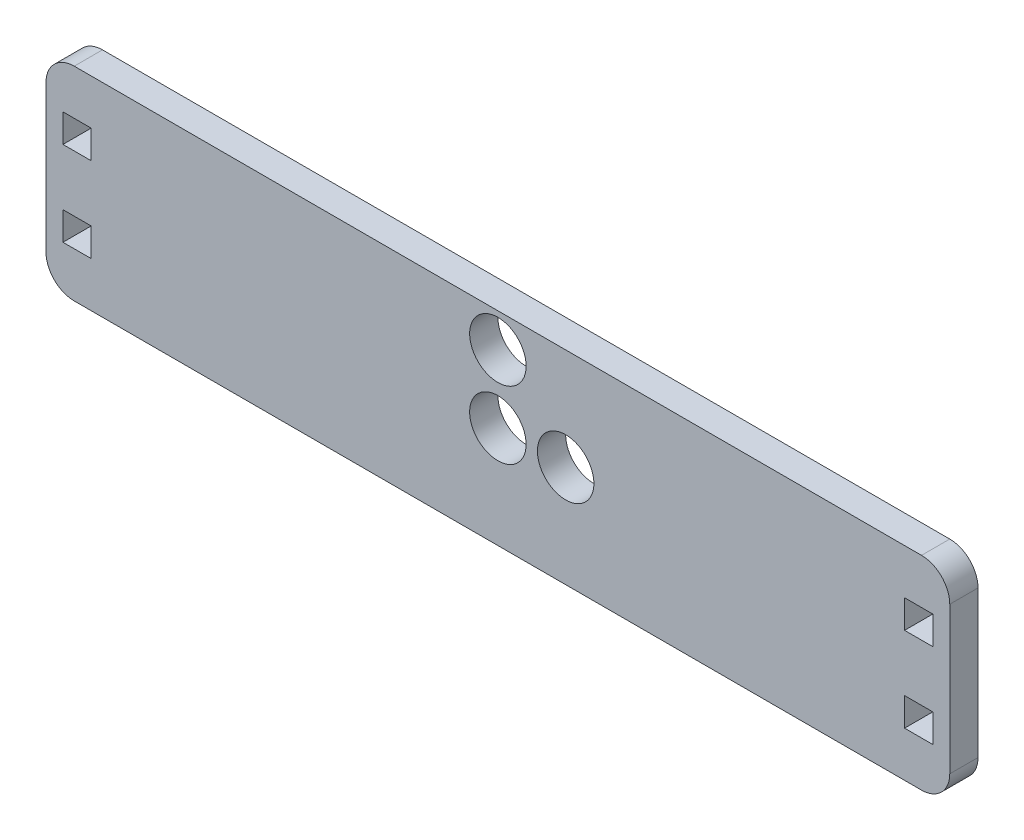
ISO-10303-21;
HEADER;
FILE_DESCRIPTION(('STEP AP214'),'2;1');
FILE_NAME('part.step','',(''),(''),'','','');
FILE_SCHEMA(('AUTOMOTIVE_DESIGN { 1 0 10303 214 1 1 1 1 }'));
ENDSEC;
DATA;
#1=APPLICATION_CONTEXT('core data for automotive mechanical design processes');
#2=APPLICATION_PROTOCOL_DEFINITION('international standard','automotive_design',2000,#1);
#3=PRODUCT_CONTEXT('',#1,'mechanical');
#4=PRODUCT('Part','Part','',(#3));
#5=PRODUCT_RELATED_PRODUCT_CATEGORY('part','',(#4));
#6=PRODUCT_DEFINITION_FORMATION('','',#4);
#7=PRODUCT_DEFINITION_CONTEXT('part definition',#1,'design');
#8=PRODUCT_DEFINITION('design','',#6,#7);
#9=PRODUCT_DEFINITION_SHAPE('','',#8);
#10=(LENGTH_UNIT() NAMED_UNIT(*) SI_UNIT(.MILLI.,.METRE.));
#11=(NAMED_UNIT(*) PLANE_ANGLE_UNIT() SI_UNIT($,.RADIAN.));
#12=(NAMED_UNIT(*) SI_UNIT($,.STERADIAN.) SOLID_ANGLE_UNIT());
#13=UNCERTAINTY_MEASURE_WITH_UNIT(LENGTH_MEASURE(1.E-05),#10,'distance_accuracy_value','');
#14=(GEOMETRIC_REPRESENTATION_CONTEXT(3) GLOBAL_UNCERTAINTY_ASSIGNED_CONTEXT((#13)) GLOBAL_UNIT_ASSIGNED_CONTEXT((#10,
#11,#12)) REPRESENTATION_CONTEXT('',''));
#15=CARTESIAN_POINT('',(0.,0.,0.));
#16=DIRECTION('',(0.,0.,1.));
#17=DIRECTION('',(1.,0.,0.));
#18=AXIS2_PLACEMENT_3D('',#15,#16,#17);
#19=CARTESIAN_POINT('',(0.,0.,5.));
#20=DIRECTION('',(0.,0.,-1.));
#21=DIRECTION('',(-1.,0.,0.));
#22=AXIS2_PLACEMENT_3D('',#19,#20,#21);
#23=PLANE('',#22);
#24=DIRECTION('',(1.,0.,0.));
#25=VECTOR('',#24,1.);
#26=CARTESIAN_POINT('',(-77.,5.,5.00000000000032));
#27=LINE('',#26,#25);
#28=CARTESIAN_POINT('',(-77.,5.,5.00000000000032));
#29=VERTEX_POINT('',#28);
#30=CARTESIAN_POINT('',(-72.,5.,5.00000000000029));
#31=VERTEX_POINT('',#30);
#32=EDGE_CURVE('E241',#29,#31,#27,.T.);
#33=ORIENTED_EDGE('',*,*,#32,.F.);
#34=DIRECTION('',(0.,-1.,0.));
#35=VECTOR('',#34,1.);
#36=CARTESIAN_POINT('',(-77.,5.,5.00000000000032));
#37=LINE('',#36,#35);
#38=CARTESIAN_POINT('',(-77.,10.,5.));
#39=VERTEX_POINT('',#38);
#40=EDGE_CURVE('E249',#39,#29,#37,.T.);
#41=ORIENTED_EDGE('',*,*,#40,.F.);
#42=DIRECTION('',(-1.,0.,0.));
#43=VECTOR('',#42,1.);
#44=CARTESIAN_POINT('',(-77.,10.,5.00000000000032));
#45=LINE('',#44,#43);
#46=CARTESIAN_POINT('',(-72.,10.,5.00000000000029));
#47=VERTEX_POINT('',#46);
#48=EDGE_CURVE('E246',#47,#39,#45,.T.);
#49=ORIENTED_EDGE('',*,*,#48,.F.);
#50=DIRECTION('',(0.,1.,0.));
#51=VECTOR('',#50,1.);
#52=CARTESIAN_POINT('',(-72.,5.,5.00000000000029));
#53=LINE('',#52,#51);
#54=EDGE_CURVE('E243',#31,#47,#53,.T.);
#55=ORIENTED_EDGE('',*,*,#54,.F.);
#56=EDGE_LOOP('',(#33,#41,#49,#55));
#57=FACE_BOUND('',#56,.T.);
#58=DIRECTION('',(1.,0.,0.));
#59=VECTOR('',#58,1.);
#60=CARTESIAN_POINT('',(77.,5.,5.));
#61=LINE('',#60,#59);
#62=CARTESIAN_POINT('',(72.,5.,5.));
#63=VERTEX_POINT('',#62);
#64=CARTESIAN_POINT('',(77.,5.,5.));
#65=VERTEX_POINT('',#64);
#66=EDGE_CURVE('E303',#63,#65,#61,.T.);
#67=ORIENTED_EDGE('',*,*,#66,.F.);
#68=DIRECTION('',(0.,-1.,0.));
#69=VECTOR('',#68,1.);
#70=CARTESIAN_POINT('',(72.,5.,5.));
#71=LINE('',#70,#69);
#72=CARTESIAN_POINT('',(72.,10.,5.));
#73=VERTEX_POINT('',#72);
#74=EDGE_CURVE('E311',#73,#63,#71,.T.);
#75=ORIENTED_EDGE('',*,*,#74,.F.);
#76=DIRECTION('',(-1.,0.,0.));
#77=VECTOR('',#76,1.);
#78=CARTESIAN_POINT('',(77.,10.,5.));
#79=LINE('',#78,#77);
#80=CARTESIAN_POINT('',(77.,10.,5.));
#81=VERTEX_POINT('',#80);
#82=EDGE_CURVE('E308',#81,#73,#79,.T.);
#83=ORIENTED_EDGE('',*,*,#82,.F.);
#84=DIRECTION('',(0.,1.,0.));
#85=VECTOR('',#84,1.);
#86=CARTESIAN_POINT('',(77.,5.,5.));
#87=LINE('',#86,#85);
#88=EDGE_CURVE('E305',#65,#81,#87,.T.);
#89=ORIENTED_EDGE('',*,*,#88,.F.);
#90=EDGE_LOOP('',(#67,#75,#83,#89));
#91=FACE_BOUND('',#90,.T.);
#92=DIRECTION('',(1.,0.,0.));
#93=VECTOR('',#92,1.);
#94=CARTESIAN_POINT('',(80.,-18.,5.));
#95=LINE('',#94,#93);
#96=CARTESIAN_POINT('',(-75.,-18.,5.));
#97=VERTEX_POINT('',#96);
#98=CARTESIAN_POINT('',(75.,-18.,5.));
#99=VERTEX_POINT('',#98);
#100=EDGE_CURVE('E355',#97,#99,#95,.T.);
#101=ORIENTED_EDGE('',*,*,#100,.T.);
#102=CARTESIAN_POINT('',(75.,-13.,5.));
#103=DIRECTION('',(0.,0.,-1.));
#104=DIRECTION('',(-1.,0.,0.));
#105=AXIS2_PLACEMENT_3D('',#102,#103,#104);
#106=CIRCLE('',#105,5.);
#107=CARTESIAN_POINT('',(80.,-13.,5.));
#108=VERTEX_POINT('',#107);
#109=EDGE_CURVE('E395',#99,#108,#106,.F.);
#110=ORIENTED_EDGE('',*,*,#109,.T.);
#111=DIRECTION('',(0.,1.,0.));
#112=VECTOR('',#111,1.);
#113=CARTESIAN_POINT('',(80.,18.,5.));
#114=LINE('',#113,#112);
#115=CARTESIAN_POINT('',(80.,13.,5.));
#116=VERTEX_POINT('',#115);
#117=EDGE_CURVE('E359',#108,#116,#114,.T.);
#118=ORIENTED_EDGE('',*,*,#117,.T.);
#119=CARTESIAN_POINT('',(75.,13.,5.));
#120=DIRECTION('',(0.,0.,-1.));
#121=DIRECTION('',(-1.,0.,0.));
#122=AXIS2_PLACEMENT_3D('',#119,#120,#121);
#123=CIRCLE('',#122,5.);
#124=CARTESIAN_POINT('',(75.,18.,5.));
#125=VERTEX_POINT('',#124);
#126=EDGE_CURVE('E59',#116,#125,#123,.F.);
#127=ORIENTED_EDGE('',*,*,#126,.T.);
#128=DIRECTION('',(-1.,0.,0.));
#129=VECTOR('',#128,1.);
#130=CARTESIAN_POINT('',(-80.,18.,5.));
#131=LINE('',#130,#129);
#132=CARTESIAN_POINT('',(-75.,18.,5.));
#133=VERTEX_POINT('',#132);
#134=EDGE_CURVE('E361',#125,#133,#131,.T.);
#135=ORIENTED_EDGE('',*,*,#134,.T.);
#136=CARTESIAN_POINT('',(-75.,13.,5.));
#137=DIRECTION('',(0.,0.,-1.));
#138=DIRECTION('',(-1.,0.,0.));
#139=AXIS2_PLACEMENT_3D('',#136,#137,#138);
#140=CIRCLE('',#139,5.);
#141=CARTESIAN_POINT('',(-80.,13.,5.));
#142=VERTEX_POINT('',#141);
#143=EDGE_CURVE('E390',#133,#142,#140,.F.);
#144=ORIENTED_EDGE('',*,*,#143,.T.);
#145=DIRECTION('',(0.,-1.,0.));
#146=VECTOR('',#145,1.);
#147=CARTESIAN_POINT('',(-80.,-18.,5.));
#148=LINE('',#147,#146);
#149=CARTESIAN_POINT('',(-80.,-13.,5.));
#150=VERTEX_POINT('',#149);
#151=EDGE_CURVE('E352',#142,#150,#148,.T.);
#152=ORIENTED_EDGE('',*,*,#151,.T.);
#153=CARTESIAN_POINT('',(-75.,-13.,5.));
#154=DIRECTION('',(0.,0.,-1.));
#155=DIRECTION('',(-1.,0.,0.));
#156=AXIS2_PLACEMENT_3D('',#153,#154,#155);
#157=CIRCLE('',#156,5.);
#158=EDGE_CURVE('E392',#150,#97,#157,.F.);
#159=ORIENTED_EDGE('',*,*,#158,.T.);
#160=EDGE_LOOP('',(#101,#110,#118,#127,#135,#144,#152,#159));
#161=FACE_BOUND('',#160,.T.);
#162=CARTESIAN_POINT('',(0.,0.,5.));
#163=DIRECTION('',(0.,0.,1.));
#164=DIRECTION('',(1.,0.,0.));
#165=AXIS2_PLACEMENT_3D('',#162,#163,#164);
#166=CIRCLE('',#165,5.);
#167=CARTESIAN_POINT('',(5.,0.,5.));
#168=VERTEX_POINT('',#167);
#169=EDGE_CURVE('E346',#168,#168,#166,.T.);
#170=ORIENTED_EDGE('',*,*,#169,.F.);
#171=EDGE_LOOP('',(#170));
#172=FACE_BOUND('',#171,.T.);
#173=CARTESIAN_POINT('',(12.,0.,5.));
#174=DIRECTION('',(0.,0.,1.));
#175=DIRECTION('',(1.,0.,0.));
#176=AXIS2_PLACEMENT_3D('',#173,#174,#175);
#177=CIRCLE('',#176,5.);
#178=CARTESIAN_POINT('',(17.,0.,5.));
#179=VERTEX_POINT('',#178);
#180=EDGE_CURVE('E340',#179,#179,#177,.T.);
#181=ORIENTED_EDGE('',*,*,#180,.F.);
#182=EDGE_LOOP('',(#181));
#183=FACE_BOUND('',#182,.T.);
#184=CARTESIAN_POINT('',(0.,12.,5.));
#185=DIRECTION('',(0.,0.,1.));
#186=DIRECTION('',(1.,0.,0.));
#187=AXIS2_PLACEMENT_3D('',#184,#185,#186);
#188=CIRCLE('',#187,5.);
#189=CARTESIAN_POINT('',(5.,12.,5.));
#190=VERTEX_POINT('',#189);
#191=EDGE_CURVE('E334',#190,#190,#188,.T.);
#192=ORIENTED_EDGE('',*,*,#191,.F.);
#193=EDGE_LOOP('',(#192));
#194=FACE_BOUND('',#193,.T.);
#195=DIRECTION('',(-1.,0.,0.));
#196=VECTOR('',#195,1.);
#197=CARTESIAN_POINT('',(77.,-5.,5.));
#198=LINE('',#197,#196);
#199=CARTESIAN_POINT('',(77.,-5.,5.));
#200=VERTEX_POINT('',#199);
#201=CARTESIAN_POINT('',(72.,-5.,5.));
#202=VERTEX_POINT('',#201);
#203=EDGE_CURVE('E272',#200,#202,#198,.T.);
#204=ORIENTED_EDGE('',*,*,#203,.F.);
#205=DIRECTION('',(0.,1.,0.));
#206=VECTOR('',#205,1.);
#207=CARTESIAN_POINT('',(77.,-5.,5.));
#208=LINE('',#207,#206);
#209=CARTESIAN_POINT('',(77.,-10.,5.));
#210=VERTEX_POINT('',#209);
#211=EDGE_CURVE('E280',#210,#200,#208,.T.);
#212=ORIENTED_EDGE('',*,*,#211,.F.);
#213=DIRECTION('',(1.,0.,0.));
#214=VECTOR('',#213,1.);
#215=CARTESIAN_POINT('',(77.,-10.,5.));
#216=LINE('',#215,#214);
#217=CARTESIAN_POINT('',(72.,-10.,5.));
#218=VERTEX_POINT('',#217);
#219=EDGE_CURVE('E277',#218,#210,#216,.T.);
#220=ORIENTED_EDGE('',*,*,#219,.F.);
#221=DIRECTION('',(0.,-1.,0.));
#222=VECTOR('',#221,1.);
#223=CARTESIAN_POINT('',(72.,-5.,5.));
#224=LINE('',#223,#222);
#225=EDGE_CURVE('E274',#202,#218,#224,.T.);
#226=ORIENTED_EDGE('',*,*,#225,.F.);
#227=EDGE_LOOP('',(#204,#212,#220,#226));
#228=FACE_BOUND('',#227,.T.);
#229=DIRECTION('',(-1.,0.,0.));
#230=VECTOR('',#229,1.);
#231=CARTESIAN_POINT('',(-77.,-5.,5.00000000000032));
#232=LINE('',#231,#230);
#233=CARTESIAN_POINT('',(-72.,-5.,5.00000000000029));
#234=VERTEX_POINT('',#233);
#235=CARTESIAN_POINT('',(-77.,-5.,5.00000000000032));
#236=VERTEX_POINT('',#235);
#237=EDGE_CURVE('E200',#234,#236,#232,.T.);
#238=ORIENTED_EDGE('',*,*,#237,.F.);
#239=DIRECTION('',(0.,1.,0.));
#240=VECTOR('',#239,1.);
#241=CARTESIAN_POINT('',(-72.,-5.,5.00000000000029));
#242=LINE('',#241,#240);
#243=CARTESIAN_POINT('',(-72.,-10.,5.));
#244=VERTEX_POINT('',#243);
#245=EDGE_CURVE('E225',#244,#234,#242,.T.);
#246=ORIENTED_EDGE('',*,*,#245,.F.);
#247=DIRECTION('',(1.,0.,0.));
#248=VECTOR('',#247,1.);
#249=CARTESIAN_POINT('',(-77.,-10.,5.00000000000032));
#250=LINE('',#249,#248);
#251=CARTESIAN_POINT('',(-77.,-10.,5.00000000000032));
#252=VERTEX_POINT('',#251);
#253=EDGE_CURVE('E223',#252,#244,#250,.T.);
#254=ORIENTED_EDGE('',*,*,#253,.F.);
#255=DIRECTION('',(0.,-1.,0.));
#256=VECTOR('',#255,1.);
#257=CARTESIAN_POINT('',(-77.,-5.,5.00000000000032));
#258=LINE('',#257,#256);
#259=EDGE_CURVE('E210',#236,#252,#258,.T.);
#260=ORIENTED_EDGE('',*,*,#259,.F.);
#261=EDGE_LOOP('',(#238,#246,#254,#260));
#262=FACE_BOUND('',#261,.T.);
#263=ADVANCED_FACE('F37',(#57,#91,#161,#172,#183,#194,#228,#262),#23,.F.);
#264=CARTESIAN_POINT('',(0.,0.,0.));
#265=DIRECTION('',(0.,0.,-1.));
#266=DIRECTION('',(-1.,0.,0.));
#267=AXIS2_PLACEMENT_3D('',#264,#265,#266);
#268=PLANE('',#267);
#269=CARTESIAN_POINT('',(12.,0.,0.));
#270=DIRECTION('',(0.,0.,1.));
#271=DIRECTION('',(1.,0.,0.));
#272=AXIS2_PLACEMENT_3D('',#269,#270,#271);
#273=CIRCLE('',#272,5.);
#274=CARTESIAN_POINT('',(17.,0.,0.));
#275=VERTEX_POINT('',#274);
#276=EDGE_CURVE('E337',#275,#275,#273,.T.);
#277=ORIENTED_EDGE('',*,*,#276,.T.);
#278=EDGE_LOOP('',(#277));
#279=FACE_BOUND('',#278,.T.);
#280=DIRECTION('',(0.,1.,0.));
#281=VECTOR('',#280,1.);
#282=CARTESIAN_POINT('',(80.,18.,0.));
#283=LINE('',#282,#281);
#284=CARTESIAN_POINT('',(80.,-13.,0.));
#285=VERTEX_POINT('',#284);
#286=CARTESIAN_POINT('',(80.,13.,0.));
#287=VERTEX_POINT('',#286);
#288=EDGE_CURVE('E369',#285,#287,#283,.T.);
#289=ORIENTED_EDGE('',*,*,#288,.F.);
#290=CARTESIAN_POINT('',(75.,-13.,0.));
#291=DIRECTION('',(0.,0.,-1.));
#292=DIRECTION('',(-1.,0.,0.));
#293=AXIS2_PLACEMENT_3D('',#290,#291,#292);
#294=CIRCLE('',#293,5.);
#295=CARTESIAN_POINT('',(75.,-18.,0.));
#296=VERTEX_POINT('',#295);
#297=EDGE_CURVE('E383',#285,#296,#294,.T.);
#298=ORIENTED_EDGE('',*,*,#297,.T.);
#299=DIRECTION('',(1.,0.,0.));
#300=VECTOR('',#299,1.);
#301=CARTESIAN_POINT('',(80.,-18.,0.));
#302=LINE('',#301,#300);
#303=CARTESIAN_POINT('',(-75.,-18.,0.));
#304=VERTEX_POINT('',#303);
#305=EDGE_CURVE('E366',#304,#296,#302,.T.);
#306=ORIENTED_EDGE('',*,*,#305,.F.);
#307=CARTESIAN_POINT('',(-75.,-13.,0.));
#308=DIRECTION('',(0.,0.,-1.));
#309=DIRECTION('',(-1.,0.,0.));
#310=AXIS2_PLACEMENT_3D('',#307,#308,#309);
#311=CIRCLE('',#310,5.);
#312=CARTESIAN_POINT('',(-80.,-13.,0.));
#313=VERTEX_POINT('',#312);
#314=EDGE_CURVE('E379',#304,#313,#311,.T.);
#315=ORIENTED_EDGE('',*,*,#314,.T.);
#316=DIRECTION('',(0.,-1.,0.));
#317=VECTOR('',#316,1.);
#318=CARTESIAN_POINT('',(-80.,-18.,0.));
#319=LINE('',#318,#317);
#320=CARTESIAN_POINT('',(-80.,13.,0.));
#321=VERTEX_POINT('',#320);
#322=EDGE_CURVE('E349',#321,#313,#319,.T.);
#323=ORIENTED_EDGE('',*,*,#322,.F.);
#324=CARTESIAN_POINT('',(-75.,13.,0.));
#325=DIRECTION('',(0.,0.,-1.));
#326=DIRECTION('',(-1.,0.,0.));
#327=AXIS2_PLACEMENT_3D('',#324,#325,#326);
#328=CIRCLE('',#327,5.);
#329=CARTESIAN_POINT('',(-75.,18.,0.));
#330=VERTEX_POINT('',#329);
#331=EDGE_CURVE('E377',#321,#330,#328,.T.);
#332=ORIENTED_EDGE('',*,*,#331,.T.);
#333=DIRECTION('',(-1.,0.,0.));
#334=VECTOR('',#333,1.);
#335=CARTESIAN_POINT('',(-80.,18.,0.));
#336=LINE('',#335,#334);
#337=CARTESIAN_POINT('',(75.,18.,0.));
#338=VERTEX_POINT('',#337);
#339=EDGE_CURVE('E356',#338,#330,#336,.T.);
#340=ORIENTED_EDGE('',*,*,#339,.F.);
#341=CARTESIAN_POINT('',(75.,13.,0.));
#342=DIRECTION('',(0.,0.,-1.));
#343=DIRECTION('',(-1.,0.,0.));
#344=AXIS2_PLACEMENT_3D('',#341,#342,#343);
#345=CIRCLE('',#344,5.);
#346=EDGE_CURVE('E381',#338,#287,#345,.T.);
#347=ORIENTED_EDGE('',*,*,#346,.T.);
#348=EDGE_LOOP('',(#289,#298,#306,#315,#323,#332,#340,#347));
#349=FACE_BOUND('',#348,.T.);
#350=CARTESIAN_POINT('',(0.,0.,0.));
#351=DIRECTION('',(0.,0.,1.));
#352=DIRECTION('',(1.,0.,0.));
#353=AXIS2_PLACEMENT_3D('',#350,#351,#352);
#354=CIRCLE('',#353,5.);
#355=CARTESIAN_POINT('',(5.,0.,0.));
#356=VERTEX_POINT('',#355);
#357=EDGE_CURVE('E343',#356,#356,#354,.T.);
#358=ORIENTED_EDGE('',*,*,#357,.T.);
#359=EDGE_LOOP('',(#358));
#360=FACE_BOUND('',#359,.T.);
#361=CARTESIAN_POINT('',(0.,12.,0.));
#362=DIRECTION('',(0.,0.,1.));
#363=DIRECTION('',(1.,0.,0.));
#364=AXIS2_PLACEMENT_3D('',#361,#362,#363);
#365=CIRCLE('',#364,5.);
#366=CARTESIAN_POINT('',(5.,12.,0.));
#367=VERTEX_POINT('',#366);
#368=EDGE_CURVE('E333',#367,#367,#365,.T.);
#369=ORIENTED_EDGE('',*,*,#368,.T.);
#370=EDGE_LOOP('',(#369));
#371=FACE_BOUND('',#370,.T.);
#372=DIRECTION('',(0.,-1.,0.));
#373=VECTOR('',#372,1.);
#374=CARTESIAN_POINT('',(72.,5.,0.));
#375=LINE('',#374,#373);
#376=CARTESIAN_POINT('',(72.,10.,0.));
#377=VERTEX_POINT('',#376);
#378=CARTESIAN_POINT('',(72.,5.,0.));
#379=VERTEX_POINT('',#378);
#380=EDGE_CURVE('E306',#377,#379,#375,.T.);
#381=ORIENTED_EDGE('',*,*,#380,.T.);
#382=DIRECTION('',(1.,0.,0.));
#383=VECTOR('',#382,1.);
#384=CARTESIAN_POINT('',(77.,5.,0.));
#385=LINE('',#384,#383);
#386=CARTESIAN_POINT('',(77.,5.,0.));
#387=VERTEX_POINT('',#386);
#388=EDGE_CURVE('E302',#379,#387,#385,.T.);
#389=ORIENTED_EDGE('',*,*,#388,.T.);
#390=DIRECTION('',(0.,1.,0.));
#391=VECTOR('',#390,1.);
#392=CARTESIAN_POINT('',(77.,5.,0.));
#393=LINE('',#392,#391);
#394=CARTESIAN_POINT('',(77.,10.,0.));
#395=VERTEX_POINT('',#394);
#396=EDGE_CURVE('E316',#387,#395,#393,.T.);
#397=ORIENTED_EDGE('',*,*,#396,.T.);
#398=DIRECTION('',(-1.,0.,0.));
#399=VECTOR('',#398,1.);
#400=CARTESIAN_POINT('',(77.,10.,0.));
#401=LINE('',#400,#399);
#402=EDGE_CURVE('E319',#395,#377,#401,.T.);
#403=ORIENTED_EDGE('',*,*,#402,.T.);
#404=EDGE_LOOP('',(#381,#389,#397,#403));
#405=FACE_BOUND('',#404,.T.);
#406=DIRECTION('',(0.,1.,0.));
#407=VECTOR('',#406,1.);
#408=CARTESIAN_POINT('',(77.,-5.,0.));
#409=LINE('',#408,#407);
#410=CARTESIAN_POINT('',(77.,-10.,0.));
#411=VERTEX_POINT('',#410);
#412=CARTESIAN_POINT('',(77.,-5.,0.));
#413=VERTEX_POINT('',#412);
#414=EDGE_CURVE('E275',#411,#413,#409,.T.);
#415=ORIENTED_EDGE('',*,*,#414,.T.);
#416=DIRECTION('',(-1.,0.,0.));
#417=VECTOR('',#416,1.);
#418=CARTESIAN_POINT('',(77.,-5.,0.));
#419=LINE('',#418,#417);
#420=CARTESIAN_POINT('',(72.,-5.,0.));
#421=VERTEX_POINT('',#420);
#422=EDGE_CURVE('E271',#413,#421,#419,.T.);
#423=ORIENTED_EDGE('',*,*,#422,.T.);
#424=DIRECTION('',(0.,-1.,0.));
#425=VECTOR('',#424,1.);
#426=CARTESIAN_POINT('',(72.,-5.,0.));
#427=LINE('',#426,#425);
#428=CARTESIAN_POINT('',(72.,-10.,0.));
#429=VERTEX_POINT('',#428);
#430=EDGE_CURVE('E285',#421,#429,#427,.T.);
#431=ORIENTED_EDGE('',*,*,#430,.T.);
#432=DIRECTION('',(1.,0.,0.));
#433=VECTOR('',#432,1.);
#434=CARTESIAN_POINT('',(77.,-10.,0.));
#435=LINE('',#434,#433);
#436=EDGE_CURVE('E288',#429,#411,#435,.T.);
#437=ORIENTED_EDGE('',*,*,#436,.T.);
#438=EDGE_LOOP('',(#415,#423,#431,#437));
#439=FACE_BOUND('',#438,.T.);
#440=DIRECTION('',(0.,-1.,0.));
#441=VECTOR('',#440,1.);
#442=CARTESIAN_POINT('',(-77.,5.,3.24109873989014E-13));
#443=LINE('',#442,#441);
#444=CARTESIAN_POINT('',(-77.,10.,3.24109873989014E-13));
#445=VERTEX_POINT('',#444);
#446=CARTESIAN_POINT('',(-77.,5.,0.));
#447=VERTEX_POINT('',#446);
#448=EDGE_CURVE('E244',#445,#447,#443,.T.);
#449=ORIENTED_EDGE('',*,*,#448,.T.);
#450=DIRECTION('',(1.,0.,0.));
#451=VECTOR('',#450,1.);
#452=CARTESIAN_POINT('',(-77.,5.,3.24109873989014E-13));
#453=LINE('',#452,#451);
#454=CARTESIAN_POINT('',(-72.,5.,2.89195060600583E-13));
#455=VERTEX_POINT('',#454);
#456=EDGE_CURVE('E218',#447,#455,#453,.T.);
#457=ORIENTED_EDGE('',*,*,#456,.T.);
#458=DIRECTION('',(0.,1.,0.));
#459=VECTOR('',#458,1.);
#460=CARTESIAN_POINT('',(-72.,5.,2.89195060600583E-13));
#461=LINE('',#460,#459);
#462=CARTESIAN_POINT('',(-72.,10.,2.89195060600583E-13));
#463=VERTEX_POINT('',#462);
#464=EDGE_CURVE('E254',#455,#463,#461,.T.);
#465=ORIENTED_EDGE('',*,*,#464,.T.);
#466=DIRECTION('',(-1.,0.,0.));
#467=VECTOR('',#466,1.);
#468=CARTESIAN_POINT('',(-77.,10.,3.24109873989014E-13));
#469=LINE('',#468,#467);
#470=EDGE_CURVE('E257',#463,#445,#469,.T.);
#471=ORIENTED_EDGE('',*,*,#470,.T.);
#472=EDGE_LOOP('',(#449,#457,#465,#471));
#473=FACE_BOUND('',#472,.T.);
#474=DIRECTION('',(0.,1.,0.));
#475=VECTOR('',#474,1.);
#476=CARTESIAN_POINT('',(-72.,-5.,2.89195060600583E-13));
#477=LINE('',#476,#475);
#478=CARTESIAN_POINT('',(-72.,-10.,2.89195060600583E-13));
#479=VERTEX_POINT('',#478);
#480=CARTESIAN_POINT('',(-72.,-5.,0.));
#481=VERTEX_POINT('',#480);
#482=EDGE_CURVE('E211',#479,#481,#477,.T.);
#483=ORIENTED_EDGE('',*,*,#482,.T.);
#484=DIRECTION('',(-1.,0.,0.));
#485=VECTOR('',#484,1.);
#486=CARTESIAN_POINT('',(-77.,-5.,3.24109873989014E-13));
#487=LINE('',#486,#485);
#488=CARTESIAN_POINT('',(-77.,-5.,3.24109873989014E-13));
#489=VERTEX_POINT('',#488);
#490=EDGE_CURVE('E229',#481,#489,#487,.T.);
#491=ORIENTED_EDGE('',*,*,#490,.T.);
#492=DIRECTION('',(0.,-1.,0.));
#493=VECTOR('',#492,1.);
#494=CARTESIAN_POINT('',(-77.,-5.,3.24109873989014E-13));
#495=LINE('',#494,#493);
#496=CARTESIAN_POINT('',(-77.,-10.,3.24109873989014E-13));
#497=VERTEX_POINT('',#496);
#498=EDGE_CURVE('E217',#489,#497,#495,.T.);
#499=ORIENTED_EDGE('',*,*,#498,.T.);
#500=DIRECTION('',(1.,0.,0.));
#501=VECTOR('',#500,1.);
#502=CARTESIAN_POINT('',(-77.,-10.,3.24109873989014E-13));
#503=LINE('',#502,#501);
#504=EDGE_CURVE('E232',#497,#479,#503,.T.);
#505=ORIENTED_EDGE('',*,*,#504,.T.);
#506=EDGE_LOOP('',(#483,#491,#499,#505));
#507=FACE_BOUND('',#506,.T.);
#508=ADVANCED_FACE('F411',(#279,#349,#360,#371,#405,#439,#473,#507),#268,.T.);
#509=CARTESIAN_POINT('',(-80.,-18.,5.));
#510=DIRECTION('',(1.,0.,0.));
#511=DIRECTION('',(0.,0.,-1.));
#512=AXIS2_PLACEMENT_3D('',#509,#510,#511);
#513=PLANE('',#512);
#514=ORIENTED_EDGE('',*,*,#322,.T.);
#515=DIRECTION('',(0.,0.,-1.));
#516=VECTOR('',#515,1.);
#517=CARTESIAN_POINT('',(-80.,-13.,5.));
#518=LINE('',#517,#516);
#519=EDGE_CURVE('E11',#313,#150,#518,.F.);
#520=ORIENTED_EDGE('',*,*,#519,.T.);
#521=ORIENTED_EDGE('',*,*,#151,.F.);
#522=DIRECTION('',(0.,0.,-1.));
#523=VECTOR('',#522,1.);
#524=CARTESIAN_POINT('',(-80.,13.,5.));
#525=LINE('',#524,#523);
#526=EDGE_CURVE('E45',#142,#321,#525,.T.);
#527=ORIENTED_EDGE('',*,*,#526,.T.);
#528=EDGE_LOOP('',(#514,#520,#521,#527));
#529=FACE_BOUND('',#528,.T.);
#530=ADVANCED_FACE('F405',(#529),#513,.F.);
#531=CARTESIAN_POINT('',(80.,-18.,5.));
#532=DIRECTION('',(0.,1.,0.));
#533=DIRECTION('',(-1.,0.,0.));
#534=AXIS2_PLACEMENT_3D('',#531,#532,#533);
#535=PLANE('',#534);
#536=ORIENTED_EDGE('',*,*,#305,.T.);
#537=DIRECTION('',(0.,0.,-1.));
#538=VECTOR('',#537,1.);
#539=CARTESIAN_POINT('',(75.,-18.,5.));
#540=LINE('',#539,#538);
#541=EDGE_CURVE('E388',#296,#99,#540,.F.);
#542=ORIENTED_EDGE('',*,*,#541,.T.);
#543=ORIENTED_EDGE('',*,*,#100,.F.);
#544=DIRECTION('',(0.,0.,-1.));
#545=VECTOR('',#544,1.);
#546=CARTESIAN_POINT('',(-75.,-18.,5.));
#547=LINE('',#546,#545);
#548=EDGE_CURVE('E385',#97,#304,#547,.T.);
#549=ORIENTED_EDGE('',*,*,#548,.T.);
#550=EDGE_LOOP('',(#536,#542,#543,#549));
#551=FACE_BOUND('',#550,.T.);
#552=ADVANCED_FACE('F421',(#551),#535,.F.);
#553=CARTESIAN_POINT('',(80.,18.,5.));
#554=DIRECTION('',(-1.,0.,0.));
#555=DIRECTION('',(0.,0.,1.));
#556=AXIS2_PLACEMENT_3D('',#553,#554,#555);
#557=PLANE('',#556);
#558=ORIENTED_EDGE('',*,*,#117,.F.);
#559=DIRECTION('',(0.,0.,-1.));
#560=VECTOR('',#559,1.);
#561=CARTESIAN_POINT('',(80.,-13.,5.));
#562=LINE('',#561,#560);
#563=EDGE_CURVE('E374',#108,#285,#562,.T.);
#564=ORIENTED_EDGE('',*,*,#563,.T.);
#565=ORIENTED_EDGE('',*,*,#288,.T.);
#566=DIRECTION('',(0.,0.,-1.));
#567=VECTOR('',#566,1.);
#568=CARTESIAN_POINT('',(80.,13.,5.));
#569=LINE('',#568,#567);
#570=EDGE_CURVE('E363',#287,#116,#569,.F.);
#571=ORIENTED_EDGE('',*,*,#570,.T.);
#572=EDGE_LOOP('',(#558,#564,#565,#571));
#573=FACE_BOUND('',#572,.T.);
#574=ADVANCED_FACE('F430',(#573),#557,.F.);
#575=CARTESIAN_POINT('',(-80.,18.,5.));
#576=DIRECTION('',(0.,-1.,0.));
#577=DIRECTION('',(0.,0.,-1.));
#578=AXIS2_PLACEMENT_3D('',#575,#576,#577);
#579=PLANE('',#578);
#580=ORIENTED_EDGE('',*,*,#134,.F.);
#581=DIRECTION('',(0.,0.,-1.));
#582=VECTOR('',#581,1.);
#583=CARTESIAN_POINT('',(75.,18.,5.));
#584=LINE('',#583,#582);
#585=EDGE_CURVE('E398',#125,#338,#584,.T.);
#586=ORIENTED_EDGE('',*,*,#585,.T.);
#587=ORIENTED_EDGE('',*,*,#339,.T.);
#588=DIRECTION('',(0.,0.,-1.));
#589=VECTOR('',#588,1.);
#590=CARTESIAN_POINT('',(-75.,18.,5.));
#591=LINE('',#590,#589);
#592=EDGE_CURVE('E52',#330,#133,#591,.F.);
#593=ORIENTED_EDGE('',*,*,#592,.T.);
#594=EDGE_LOOP('',(#580,#586,#587,#593));
#595=FACE_BOUND('',#594,.T.);
#596=ADVANCED_FACE('F435',(#595),#579,.F.);
#597=CARTESIAN_POINT('',(0.,0.,5.));
#598=DIRECTION('',(0.,0.,-1.));
#599=DIRECTION('',(-1.,0.,0.));
#600=AXIS2_PLACEMENT_3D('',#597,#598,#599);
#601=CYLINDRICAL_SURFACE('',#600,5.);
#602=ORIENTED_EDGE('',*,*,#169,.T.);
#603=EDGE_LOOP('',(#602));
#604=FACE_BOUND('',#603,.T.);
#605=ORIENTED_EDGE('',*,*,#357,.F.);
#606=EDGE_LOOP('',(#605));
#607=FACE_BOUND('',#606,.T.);
#608=ADVANCED_FACE('F451',(#604,#607),#601,.F.);
#609=CARTESIAN_POINT('',(12.,0.,5.));
#610=DIRECTION('',(0.,0.,-1.));
#611=DIRECTION('',(-1.,0.,0.));
#612=AXIS2_PLACEMENT_3D('',#609,#610,#611);
#613=CYLINDRICAL_SURFACE('',#612,5.);
#614=ORIENTED_EDGE('',*,*,#180,.T.);
#615=EDGE_LOOP('',(#614));
#616=FACE_BOUND('',#615,.T.);
#617=ORIENTED_EDGE('',*,*,#276,.F.);
#618=EDGE_LOOP('',(#617));
#619=FACE_BOUND('',#618,.T.);
#620=ADVANCED_FACE('F656',(#616,#619),#613,.F.);
#621=CARTESIAN_POINT('',(0.,12.,5.));
#622=DIRECTION('',(0.,0.,-1.));
#623=DIRECTION('',(-1.,0.,0.));
#624=AXIS2_PLACEMENT_3D('',#621,#622,#623);
#625=CYLINDRICAL_SURFACE('',#624,5.);
#626=ORIENTED_EDGE('',*,*,#191,.T.);
#627=EDGE_LOOP('',(#626));
#628=FACE_BOUND('',#627,.T.);
#629=ORIENTED_EDGE('',*,*,#368,.F.);
#630=EDGE_LOOP('',(#629));
#631=FACE_BOUND('',#630,.T.);
#632=ADVANCED_FACE('F646',(#628,#631),#625,.F.);
#633=CARTESIAN_POINT('',(77.,5.,5.));
#634=DIRECTION('',(0.,1.,0.));
#635=DIRECTION('',(0.,0.,1.));
#636=AXIS2_PLACEMENT_3D('',#633,#634,#635);
#637=PLANE('',#636);
#638=ORIENTED_EDGE('',*,*,#388,.F.);
#639=DIRECTION('',(0.,0.,-1.));
#640=VECTOR('',#639,1.);
#641=CARTESIAN_POINT('',(72.,5.,5.));
#642=LINE('',#641,#640);
#643=EDGE_CURVE('E313',#63,#379,#642,.T.);
#644=ORIENTED_EDGE('',*,*,#643,.F.);
#645=ORIENTED_EDGE('',*,*,#66,.T.);
#646=DIRECTION('',(0.,0.,-1.));
#647=VECTOR('',#646,1.);
#648=CARTESIAN_POINT('',(77.,5.,5.));
#649=LINE('',#648,#647);
#650=EDGE_CURVE('E330',#65,#387,#649,.T.);
#651=ORIENTED_EDGE('',*,*,#650,.T.);
#652=EDGE_LOOP('',(#638,#644,#645,#651));
#653=FACE_BOUND('',#652,.T.);
#654=ADVANCED_FACE('F636',(#653),#637,.T.);
#655=CARTESIAN_POINT('',(77.,5.,5.));
#656=DIRECTION('',(-1.,0.,0.));
#657=DIRECTION('',(0.,0.,1.));
#658=AXIS2_PLACEMENT_3D('',#655,#656,#657);
#659=PLANE('',#658);
#660=ORIENTED_EDGE('',*,*,#396,.F.);
#661=ORIENTED_EDGE('',*,*,#650,.F.);
#662=ORIENTED_EDGE('',*,*,#88,.T.);
#663=DIRECTION('',(0.,0.,-1.));
#664=VECTOR('',#663,1.);
#665=CARTESIAN_POINT('',(77.,10.,5.));
#666=LINE('',#665,#664);
#667=EDGE_CURVE('E328',#81,#395,#666,.T.);
#668=ORIENTED_EDGE('',*,*,#667,.T.);
#669=EDGE_LOOP('',(#660,#661,#662,#668));
#670=FACE_BOUND('',#669,.T.);
#671=ADVANCED_FACE('F626',(#670),#659,.T.);
#672=CARTESIAN_POINT('',(77.,10.,5.));
#673=DIRECTION('',(0.,-1.,0.));
#674=DIRECTION('',(0.,0.,-1.));
#675=AXIS2_PLACEMENT_3D('',#672,#673,#674);
#676=PLANE('',#675);
#677=ORIENTED_EDGE('',*,*,#402,.F.);
#678=ORIENTED_EDGE('',*,*,#667,.F.);
#679=ORIENTED_EDGE('',*,*,#82,.T.);
#680=DIRECTION('',(0.,0.,-1.));
#681=VECTOR('',#680,1.);
#682=CARTESIAN_POINT('',(72.,10.,5.));
#683=LINE('',#682,#681);
#684=EDGE_CURVE('E326',#73,#377,#683,.T.);
#685=ORIENTED_EDGE('',*,*,#684,.T.);
#686=EDGE_LOOP('',(#677,#678,#679,#685));
#687=FACE_BOUND('',#686,.T.);
#688=ADVANCED_FACE('F616',(#687),#676,.T.);
#689=CARTESIAN_POINT('',(72.,5.,5.));
#690=DIRECTION('',(1.,0.,0.));
#691=DIRECTION('',(0.,0.,-1.));
#692=AXIS2_PLACEMENT_3D('',#689,#690,#691);
#693=PLANE('',#692);
#694=ORIENTED_EDGE('',*,*,#380,.F.);
#695=ORIENTED_EDGE('',*,*,#684,.F.);
#696=ORIENTED_EDGE('',*,*,#74,.T.);
#697=ORIENTED_EDGE('',*,*,#643,.T.);
#698=EDGE_LOOP('',(#694,#695,#696,#697));
#699=FACE_BOUND('',#698,.T.);
#700=ADVANCED_FACE('F606',(#699),#693,.T.);
#701=CARTESIAN_POINT('',(77.,-5.,5.));
#702=DIRECTION('',(0.,-1.,0.));
#703=DIRECTION('',(0.,0.,-1.));
#704=AXIS2_PLACEMENT_3D('',#701,#702,#703);
#705=PLANE('',#704);
#706=ORIENTED_EDGE('',*,*,#422,.F.);
#707=DIRECTION('',(0.,0.,-1.));
#708=VECTOR('',#707,1.);
#709=CARTESIAN_POINT('',(77.,-5.,5.));
#710=LINE('',#709,#708);
#711=EDGE_CURVE('E282',#200,#413,#710,.T.);
#712=ORIENTED_EDGE('',*,*,#711,.F.);
#713=ORIENTED_EDGE('',*,*,#203,.T.);
#714=DIRECTION('',(0.,0.,-1.));
#715=VECTOR('',#714,1.);
#716=CARTESIAN_POINT('',(72.,-5.,5.));
#717=LINE('',#716,#715);
#718=EDGE_CURVE('E299',#202,#421,#717,.T.);
#719=ORIENTED_EDGE('',*,*,#718,.T.);
#720=EDGE_LOOP('',(#706,#712,#713,#719));
#721=FACE_BOUND('',#720,.T.);
#722=ADVANCED_FACE('F596',(#721),#705,.T.);
#723=CARTESIAN_POINT('',(72.,-5.,5.));
#724=DIRECTION('',(1.,0.,0.));
#725=DIRECTION('',(0.,0.,-1.));
#726=AXIS2_PLACEMENT_3D('',#723,#724,#725);
#727=PLANE('',#726);
#728=ORIENTED_EDGE('',*,*,#430,.F.);
#729=ORIENTED_EDGE('',*,*,#718,.F.);
#730=ORIENTED_EDGE('',*,*,#225,.T.);
#731=DIRECTION('',(0.,0.,-1.));
#732=VECTOR('',#731,1.);
#733=CARTESIAN_POINT('',(72.,-10.,5.));
#734=LINE('',#733,#732);
#735=EDGE_CURVE('E297',#218,#429,#734,.T.);
#736=ORIENTED_EDGE('',*,*,#735,.T.);
#737=EDGE_LOOP('',(#728,#729,#730,#736));
#738=FACE_BOUND('',#737,.T.);
#739=ADVANCED_FACE('F586',(#738),#727,.T.);
#740=CARTESIAN_POINT('',(77.,-10.,5.));
#741=DIRECTION('',(0.,1.,0.));
#742=DIRECTION('',(0.,0.,1.));
#743=AXIS2_PLACEMENT_3D('',#740,#741,#742);
#744=PLANE('',#743);
#745=ORIENTED_EDGE('',*,*,#436,.F.);
#746=ORIENTED_EDGE('',*,*,#735,.F.);
#747=ORIENTED_EDGE('',*,*,#219,.T.);
#748=DIRECTION('',(0.,0.,-1.));
#749=VECTOR('',#748,1.);
#750=CARTESIAN_POINT('',(77.,-10.,5.));
#751=LINE('',#750,#749);
#752=EDGE_CURVE('E295',#210,#411,#751,.T.);
#753=ORIENTED_EDGE('',*,*,#752,.T.);
#754=EDGE_LOOP('',(#745,#746,#747,#753));
#755=FACE_BOUND('',#754,.T.);
#756=ADVANCED_FACE('F576',(#755),#744,.T.);
#757=CARTESIAN_POINT('',(77.,-5.,5.));
#758=DIRECTION('',(-1.,0.,0.));
#759=DIRECTION('',(0.,0.,1.));
#760=AXIS2_PLACEMENT_3D('',#757,#758,#759);
#761=PLANE('',#760);
#762=ORIENTED_EDGE('',*,*,#414,.F.);
#763=ORIENTED_EDGE('',*,*,#752,.F.);
#764=ORIENTED_EDGE('',*,*,#211,.T.);
#765=ORIENTED_EDGE('',*,*,#711,.T.);
#766=EDGE_LOOP('',(#762,#763,#764,#765));
#767=FACE_BOUND('',#766,.T.);
#768=ADVANCED_FACE('F566',(#767),#761,.T.);
#769=CARTESIAN_POINT('',(-77.,5.,5.00000000000032));
#770=DIRECTION('',(0.,1.,0.));
#771=DIRECTION('',(0.,0.,1.));
#772=AXIS2_PLACEMENT_3D('',#769,#770,#771);
#773=PLANE('',#772);
#774=ORIENTED_EDGE('',*,*,#456,.F.);
#775=DIRECTION('',(0.,0.,-1.));
#776=VECTOR('',#775,1.);
#777=CARTESIAN_POINT('',(-77.,5.,5.00000000000032));
#778=LINE('',#777,#776);
#779=EDGE_CURVE('E251',#29,#447,#778,.T.);
#780=ORIENTED_EDGE('',*,*,#779,.F.);
#781=ORIENTED_EDGE('',*,*,#32,.T.);
#782=DIRECTION('',(0.,0.,-1.));
#783=VECTOR('',#782,1.);
#784=CARTESIAN_POINT('',(-72.,5.,5.00000000000029));
#785=LINE('',#784,#783);
#786=EDGE_CURVE('E268',#31,#455,#785,.T.);
#787=ORIENTED_EDGE('',*,*,#786,.T.);
#788=EDGE_LOOP('',(#774,#780,#781,#787));
#789=FACE_BOUND('',#788,.T.);
#790=ADVANCED_FACE('F556',(#789),#773,.T.);
#791=CARTESIAN_POINT('',(-72.,5.,5.00000000000029));
#792=DIRECTION('',(-1.,0.,0.));
#793=DIRECTION('',(0.,0.,1.));
#794=AXIS2_PLACEMENT_3D('',#791,#792,#793);
#795=PLANE('',#794);
#796=ORIENTED_EDGE('',*,*,#464,.F.);
#797=ORIENTED_EDGE('',*,*,#786,.F.);
#798=ORIENTED_EDGE('',*,*,#54,.T.);
#799=DIRECTION('',(0.,0.,-1.));
#800=VECTOR('',#799,1.);
#801=CARTESIAN_POINT('',(-72.,10.,5.00000000000029));
#802=LINE('',#801,#800);
#803=EDGE_CURVE('E266',#47,#463,#802,.T.);
#804=ORIENTED_EDGE('',*,*,#803,.T.);
#805=EDGE_LOOP('',(#796,#797,#798,#804));
#806=FACE_BOUND('',#805,.T.);
#807=ADVANCED_FACE('F546',(#806),#795,.T.);
#808=CARTESIAN_POINT('',(-77.,10.,5.00000000000032));
#809=DIRECTION('',(0.,-1.,0.));
#810=DIRECTION('',(0.,0.,-1.));
#811=AXIS2_PLACEMENT_3D('',#808,#809,#810);
#812=PLANE('',#811);
#813=ORIENTED_EDGE('',*,*,#470,.F.);
#814=ORIENTED_EDGE('',*,*,#803,.F.);
#815=ORIENTED_EDGE('',*,*,#48,.T.);
#816=DIRECTION('',(0.,0.,-1.));
#817=VECTOR('',#816,1.);
#818=CARTESIAN_POINT('',(-77.,10.,5.00000000000032));
#819=LINE('',#818,#817);
#820=EDGE_CURVE('E264',#39,#445,#819,.T.);
#821=ORIENTED_EDGE('',*,*,#820,.T.);
#822=EDGE_LOOP('',(#813,#814,#815,#821));
#823=FACE_BOUND('',#822,.T.);
#824=ADVANCED_FACE('F536',(#823),#812,.T.);
#825=CARTESIAN_POINT('',(-77.,5.,5.00000000000032));
#826=DIRECTION('',(1.,0.,0.));
#827=DIRECTION('',(0.,0.,-1.));
#828=AXIS2_PLACEMENT_3D('',#825,#826,#827);
#829=PLANE('',#828);
#830=ORIENTED_EDGE('',*,*,#448,.F.);
#831=ORIENTED_EDGE('',*,*,#820,.F.);
#832=ORIENTED_EDGE('',*,*,#40,.T.);
#833=ORIENTED_EDGE('',*,*,#779,.T.);
#834=EDGE_LOOP('',(#830,#831,#832,#833));
#835=FACE_BOUND('',#834,.T.);
#836=ADVANCED_FACE('F527',(#835),#829,.T.);
#837=CARTESIAN_POINT('',(-77.,-5.,5.00000000000032));
#838=DIRECTION('',(0.,-1.,0.));
#839=DIRECTION('',(0.,0.,-1.));
#840=AXIS2_PLACEMENT_3D('',#837,#838,#839);
#841=PLANE('',#840);
#842=ORIENTED_EDGE('',*,*,#490,.F.);
#843=DIRECTION('',(0.,0.,-1.));
#844=VECTOR('',#843,1.);
#845=CARTESIAN_POINT('',(-72.,-5.,5.00000000000029));
#846=LINE('',#845,#844);
#847=EDGE_CURVE('E206',#234,#481,#846,.T.);
#848=ORIENTED_EDGE('',*,*,#847,.F.);
#849=ORIENTED_EDGE('',*,*,#237,.T.);
#850=DIRECTION('',(0.,0.,-1.));
#851=VECTOR('',#850,1.);
#852=CARTESIAN_POINT('',(-77.,-5.,5.00000000000032));
#853=LINE('',#852,#851);
#854=EDGE_CURVE('E203',#236,#489,#853,.T.);
#855=ORIENTED_EDGE('',*,*,#854,.T.);
#856=EDGE_LOOP('',(#842,#848,#849,#855));
#857=FACE_BOUND('',#856,.T.);
#858=ADVANCED_FACE('F202',(#857),#841,.T.);
#859=CARTESIAN_POINT('',(-77.,-5.,5.00000000000032));
#860=DIRECTION('',(1.,0.,0.));
#861=DIRECTION('',(0.,0.,-1.));
#862=AXIS2_PLACEMENT_3D('',#859,#860,#861);
#863=PLANE('',#862);
#864=ORIENTED_EDGE('',*,*,#498,.F.);
#865=ORIENTED_EDGE('',*,*,#854,.F.);
#866=ORIENTED_EDGE('',*,*,#259,.T.);
#867=DIRECTION('',(0.,0.,-1.));
#868=VECTOR('',#867,1.);
#869=CARTESIAN_POINT('',(-77.,-10.,5.00000000000032));
#870=LINE('',#869,#868);
#871=EDGE_CURVE('E219',#252,#497,#870,.T.);
#872=ORIENTED_EDGE('',*,*,#871,.T.);
#873=EDGE_LOOP('',(#864,#865,#866,#872));
#874=FACE_BOUND('',#873,.T.);
#875=ADVANCED_FACE('F214',(#874),#863,.T.);
#876=CARTESIAN_POINT('',(-77.,-10.,5.00000000000032));
#877=DIRECTION('',(0.,1.,0.));
#878=DIRECTION('',(0.,0.,1.));
#879=AXIS2_PLACEMENT_3D('',#876,#877,#878);
#880=PLANE('',#879);
#881=ORIENTED_EDGE('',*,*,#504,.F.);
#882=ORIENTED_EDGE('',*,*,#871,.F.);
#883=ORIENTED_EDGE('',*,*,#253,.T.);
#884=DIRECTION('',(0.,0.,-1.));
#885=VECTOR('',#884,1.);
#886=CARTESIAN_POINT('',(-72.,-10.,5.00000000000029));
#887=LINE('',#886,#885);
#888=EDGE_CURVE('E238',#244,#479,#887,.T.);
#889=ORIENTED_EDGE('',*,*,#888,.T.);
#890=EDGE_LOOP('',(#881,#882,#883,#889));
#891=FACE_BOUND('',#890,.T.);
#892=ADVANCED_FACE('F500',(#891),#880,.T.);
#893=CARTESIAN_POINT('',(-72.,-5.,5.00000000000029));
#894=DIRECTION('',(-1.,0.,0.));
#895=DIRECTION('',(0.,0.,1.));
#896=AXIS2_PLACEMENT_3D('',#893,#894,#895);
#897=PLANE('',#896);
#898=ORIENTED_EDGE('',*,*,#482,.F.);
#899=ORIENTED_EDGE('',*,*,#888,.F.);
#900=ORIENTED_EDGE('',*,*,#245,.T.);
#901=ORIENTED_EDGE('',*,*,#847,.T.);
#902=EDGE_LOOP('',(#898,#899,#900,#901));
#903=FACE_BOUND('',#902,.T.);
#904=ADVANCED_FACE('F464',(#903),#897,.T.);
#905=CARTESIAN_POINT('',(75.,-13.,5.));
#906=DIRECTION('',(0.,0.,-1.));
#907=DIRECTION('',(-1.,0.,0.));
#908=AXIS2_PLACEMENT_3D('',#905,#906,#907);
#909=CYLINDRICAL_SURFACE('',#908,5.);
#910=ORIENTED_EDGE('',*,*,#109,.F.);
#911=ORIENTED_EDGE('',*,*,#541,.F.);
#912=ORIENTED_EDGE('',*,*,#297,.F.);
#913=ORIENTED_EDGE('',*,*,#563,.F.);
#914=EDGE_LOOP('',(#910,#911,#912,#913));
#915=FACE_BOUND('',#914,.T.);
#916=ADVANCED_FACE('F428',(#915),#909,.T.);
#917=CARTESIAN_POINT('',(75.,13.,5.));
#918=DIRECTION('',(0.,0.,-1.));
#919=DIRECTION('',(-1.,0.,0.));
#920=AXIS2_PLACEMENT_3D('',#917,#918,#919);
#921=CYLINDRICAL_SURFACE('',#920,5.);
#922=ORIENTED_EDGE('',*,*,#126,.F.);
#923=ORIENTED_EDGE('',*,*,#570,.F.);
#924=ORIENTED_EDGE('',*,*,#346,.F.);
#925=ORIENTED_EDGE('',*,*,#585,.F.);
#926=EDGE_LOOP('',(#922,#923,#924,#925));
#927=FACE_BOUND('',#926,.T.);
#928=ADVANCED_FACE('F434',(#927),#921,.T.);
#929=CARTESIAN_POINT('',(-75.,-13.,5.));
#930=DIRECTION('',(0.,0.,-1.));
#931=DIRECTION('',(-1.,0.,0.));
#932=AXIS2_PLACEMENT_3D('',#929,#930,#931);
#933=CYLINDRICAL_SURFACE('',#932,5.);
#934=ORIENTED_EDGE('',*,*,#158,.F.);
#935=ORIENTED_EDGE('',*,*,#519,.F.);
#936=ORIENTED_EDGE('',*,*,#314,.F.);
#937=ORIENTED_EDGE('',*,*,#548,.F.);
#938=EDGE_LOOP('',(#934,#935,#936,#937));
#939=FACE_BOUND('',#938,.T.);
#940=ADVANCED_FACE('F418',(#939),#933,.T.);
#941=CARTESIAN_POINT('',(-75.,13.,5.));
#942=DIRECTION('',(0.,0.,-1.));
#943=DIRECTION('',(-1.,0.,0.));
#944=AXIS2_PLACEMENT_3D('',#941,#942,#943);
#945=CYLINDRICAL_SURFACE('',#944,5.);
#946=ORIENTED_EDGE('',*,*,#143,.F.);
#947=ORIENTED_EDGE('',*,*,#592,.F.);
#948=ORIENTED_EDGE('',*,*,#331,.F.);
#949=ORIENTED_EDGE('',*,*,#526,.F.);
#950=EDGE_LOOP('',(#946,#947,#948,#949));
#951=FACE_BOUND('',#950,.T.);
#952=ADVANCED_FACE('F39',(#951),#945,.T.);
#953=CLOSED_SHELL('',(#263,#508,#530,#552,#574,#596,#608,#620,#632,#654,#671,#688,#700,#722,
#739,#756,#768,#790,#807,#824,#836,#858,#875,#892,#904,#916,#928,#940,#952));
#954=MANIFOLD_SOLID_BREP('B2',#953);
#955=ADVANCED_BREP_SHAPE_REPRESENTATION('',(#18,#954),#14);
#956=SHAPE_DEFINITION_REPRESENTATION(#9,#955);
ENDSEC;
END-ISO-10303-21;
